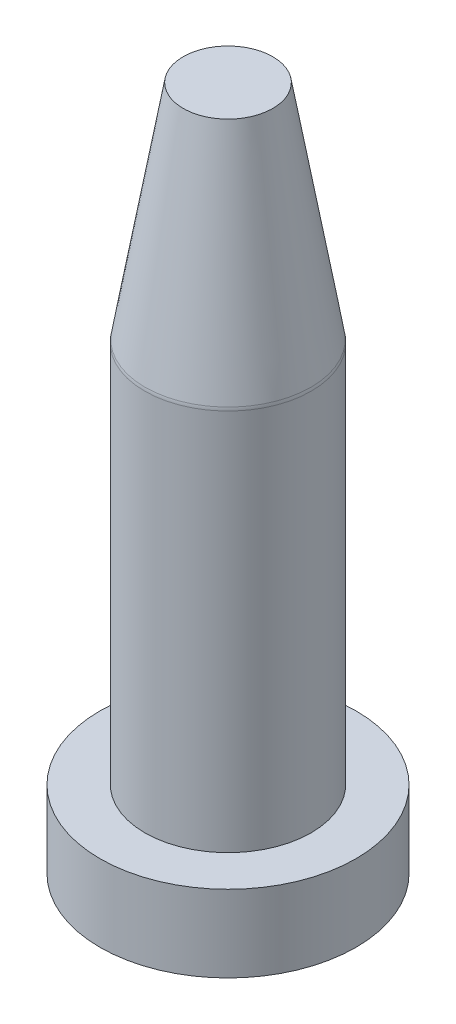
ISO-10303-21;
HEADER;
FILE_DESCRIPTION(('STEP AP214'),'2;1');
FILE_NAME('part.step','',(''),(''),'','','');
FILE_SCHEMA(('AUTOMOTIVE_DESIGN { 1 0 10303 214 1 1 1 1 }'));
ENDSEC;
DATA;
#1=APPLICATION_CONTEXT('core data for automotive mechanical design processes');
#2=APPLICATION_PROTOCOL_DEFINITION('international standard','automotive_design',2000,#1);
#3=PRODUCT_CONTEXT('',#1,'mechanical');
#4=PRODUCT('Part','Part','',(#3));
#5=PRODUCT_RELATED_PRODUCT_CATEGORY('part','',(#4));
#6=PRODUCT_DEFINITION_FORMATION('','',#4);
#7=PRODUCT_DEFINITION_CONTEXT('part definition',#1,'design');
#8=PRODUCT_DEFINITION('design','',#6,#7);
#9=PRODUCT_DEFINITION_SHAPE('','',#8);
#10=(LENGTH_UNIT() NAMED_UNIT(*) SI_UNIT(.MILLI.,.METRE.));
#11=(NAMED_UNIT(*) PLANE_ANGLE_UNIT() SI_UNIT($,.RADIAN.));
#12=(NAMED_UNIT(*) SI_UNIT($,.STERADIAN.) SOLID_ANGLE_UNIT());
#13=UNCERTAINTY_MEASURE_WITH_UNIT(LENGTH_MEASURE(1.E-05),#10,'distance_accuracy_value','');
#14=(GEOMETRIC_REPRESENTATION_CONTEXT(3) GLOBAL_UNCERTAINTY_ASSIGNED_CONTEXT((#13)) GLOBAL_UNIT_ASSIGNED_CONTEXT((#10,
#11,#12)) REPRESENTATION_CONTEXT('',''));
#15=CARTESIAN_POINT('',(0.,0.,0.));
#16=DIRECTION('',(0.,0.,1.));
#17=DIRECTION('',(1.,0.,0.));
#18=AXIS2_PLACEMENT_3D('',#15,#16,#17);
#19=CARTESIAN_POINT('',(0.,107.,0.));
#20=DIRECTION('',(0.,1.,0.));
#21=DIRECTION('',(0.,0.,1.));
#22=AXIS2_PLACEMENT_3D('',#19,#20,#21);
#23=PLANE('',#22);
#24=CARTESIAN_POINT('',(0.,107.,0.));
#25=DIRECTION('',(0.,-1.,0.));
#26=DIRECTION('',(0.,0.,-1.));
#27=AXIS2_PLACEMENT_3D('',#24,#25,#26);
#28=CIRCLE('',#27,7.);
#29=CARTESIAN_POINT('',(0.,107.,-7.));
#30=VERTEX_POINT('',#29);
#31=EDGE_CURVE('E43',#30,#30,#28,.T.);
#32=ORIENTED_EDGE('',*,*,#31,.F.);
#33=EDGE_LOOP('',(#32));
#34=FACE_BOUND('',#33,.T.);
#35=ADVANCED_FACE('F32',(#34),#23,.T.);
#36=CARTESIAN_POINT('',(0.,72.,0.));
#37=DIRECTION('',(0.,-1.,0.));
#38=DIRECTION('',(0.,0.,-1.));
#39=AXIS2_PLACEMENT_3D('',#36,#37,#38);
#40=CONICAL_SURFACE('',#39,13.,0.169778273968339);
#41=CARTESIAN_POINT('',(0.,72.2516105407678,0.));
#42=DIRECTION('',(0.,1.,0.));
#43=DIRECTION('',(0.,0.,1.));
#44=AXIS2_PLACEMENT_3D('',#41,#42,#43);
#45=CIRCLE('',#44,12.9568667644398);
#46=CARTESIAN_POINT('',(0.,72.2516105407678,12.9568667644398));
#47=VERTEX_POINT('',#46);
#48=EDGE_CURVE('E10',#47,#47,#45,.T.);
#49=ORIENTED_EDGE('',*,*,#48,.T.);
#50=EDGE_LOOP('',(#49));
#51=FACE_BOUND('',#50,.T.);
#52=ORIENTED_EDGE('',*,*,#31,.T.);
#53=EDGE_LOOP('',(#52));
#54=FACE_BOUND('',#53,.T.);
#55=ADVANCED_FACE('F75',(#51,#54),#40,.T.);
#56=CARTESIAN_POINT('',(0.,0.,0.));
#57=DIRECTION('',(0.,-1.,0.));
#58=DIRECTION('',(0.,0.,-1.));
#59=AXIS2_PLACEMENT_3D('',#56,#57,#58);
#60=CYLINDRICAL_SURFACE('',#59,13.);
#61=CARTESIAN_POINT('',(0.,71.7447190954353,0.));
#62=DIRECTION('',(0.,1.,0.));
#63=DIRECTION('',(0.,0.,1.));
#64=AXIS2_PLACEMENT_3D('',#61,#62,#63);
#65=CIRCLE('',#64,13.);
#66=CARTESIAN_POINT('',(0.,71.7447190954353,13.));
#67=VERTEX_POINT('',#66);
#68=EDGE_CURVE('E39',#67,#67,#65,.F.);
#69=ORIENTED_EDGE('',*,*,#68,.T.);
#70=EDGE_LOOP('',(#69));
#71=FACE_BOUND('',#70,.T.);
#72=CARTESIAN_POINT('',(0.,12.,0.));
#73=DIRECTION('',(0.,-1.,0.));
#74=DIRECTION('',(0.,0.,-1.));
#75=AXIS2_PLACEMENT_3D('',#72,#73,#74);
#76=CIRCLE('',#75,13.);
#77=CARTESIAN_POINT('',(0.,12.,-13.));
#78=VERTEX_POINT('',#77);
#79=EDGE_CURVE('E47',#78,#78,#76,.T.);
#80=ORIENTED_EDGE('',*,*,#79,.F.);
#81=EDGE_LOOP('',(#80));
#82=FACE_BOUND('',#81,.T.);
#83=ADVANCED_FACE('F71',(#71,#82),#60,.T.);
#84=CARTESIAN_POINT('',(20.,12.,0.));
#85=DIRECTION('',(0.,1.,0.));
#86=DIRECTION('',(0.,0.,1.));
#87=AXIS2_PLACEMENT_3D('',#84,#85,#86);
#88=PLANE('',#87);
#89=ORIENTED_EDGE('',*,*,#79,.T.);
#90=EDGE_LOOP('',(#89));
#91=FACE_BOUND('',#90,.T.);
#92=CARTESIAN_POINT('',(0.,12.,0.));
#93=DIRECTION('',(0.,-1.,0.));
#94=DIRECTION('',(0.,0.,-1.));
#95=AXIS2_PLACEMENT_3D('',#92,#93,#94);
#96=CIRCLE('',#95,20.);
#97=CARTESIAN_POINT('',(0.,12.,-20.));
#98=VERTEX_POINT('',#97);
#99=EDGE_CURVE('E52',#98,#98,#96,.T.);
#100=ORIENTED_EDGE('',*,*,#99,.F.);
#101=EDGE_LOOP('',(#100));
#102=FACE_BOUND('',#101,.T.);
#103=ADVANCED_FACE('F63',(#91,#102),#88,.T.);
#104=CARTESIAN_POINT('',(0.,0.,0.));
#105=DIRECTION('',(0.,-1.,0.));
#106=DIRECTION('',(0.,0.,-1.));
#107=AXIS2_PLACEMENT_3D('',#104,#105,#106);
#108=CYLINDRICAL_SURFACE('',#107,20.);
#109=ORIENTED_EDGE('',*,*,#99,.T.);
#110=EDGE_LOOP('',(#109));
#111=FACE_BOUND('',#110,.T.);
#112=CARTESIAN_POINT('',(0.,0.,0.));
#113=DIRECTION('',(0.,-1.,0.));
#114=DIRECTION('',(0.,0.,-1.));
#115=AXIS2_PLACEMENT_3D('',#112,#113,#114);
#116=CIRCLE('',#115,20.);
#117=CARTESIAN_POINT('',(0.,0.,-20.));
#118=VERTEX_POINT('',#117);
#119=EDGE_CURVE('E55',#118,#118,#116,.T.);
#120=ORIENTED_EDGE('',*,*,#119,.F.);
#121=EDGE_LOOP('',(#120));
#122=FACE_BOUND('',#121,.T.);
#123=ADVANCED_FACE('F61',(#111,#122),#108,.T.);
#124=CARTESIAN_POINT('',(0.,0.,0.));
#125=DIRECTION('',(0.,-1.,0.));
#126=DIRECTION('',(0.,0.,-1.));
#127=AXIS2_PLACEMENT_3D('',#124,#125,#126);
#128=PLANE('',#127);
#129=ORIENTED_EDGE('',*,*,#119,.T.);
#130=EDGE_LOOP('',(#129));
#131=FACE_BOUND('',#130,.T.);
#132=ADVANCED_FACE('F59',(#131),#128,.T.);
#133=CARTESIAN_POINT('',(0.,71.7447190954353,0.));
#134=DIRECTION('',(0.,1.,0.));
#135=DIRECTION('',(0.,0.,1.));
#136=AXIS2_PLACEMENT_3D('',#133,#134,#135);
#137=TOROIDAL_SURFACE('',#136,10.,3.);
#138=ORIENTED_EDGE('',*,*,#48,.F.);
#139=EDGE_LOOP('',(#138));
#140=FACE_BOUND('',#139,.T.);
#141=ORIENTED_EDGE('',*,*,#68,.F.);
#142=EDGE_LOOP('',(#141));
#143=FACE_BOUND('',#142,.T.);
#144=ADVANCED_FACE('F34',(#140,#143),#137,.T.);
#145=CLOSED_SHELL('',(#35,#55,#83,#103,#123,#132,#144));
#146=MANIFOLD_SOLID_BREP('B2',#145);
#147=ADVANCED_BREP_SHAPE_REPRESENTATION('',(#18,#146),#14);
#148=SHAPE_DEFINITION_REPRESENTATION(#9,#147);
ENDSEC;
END-ISO-10303-21;
